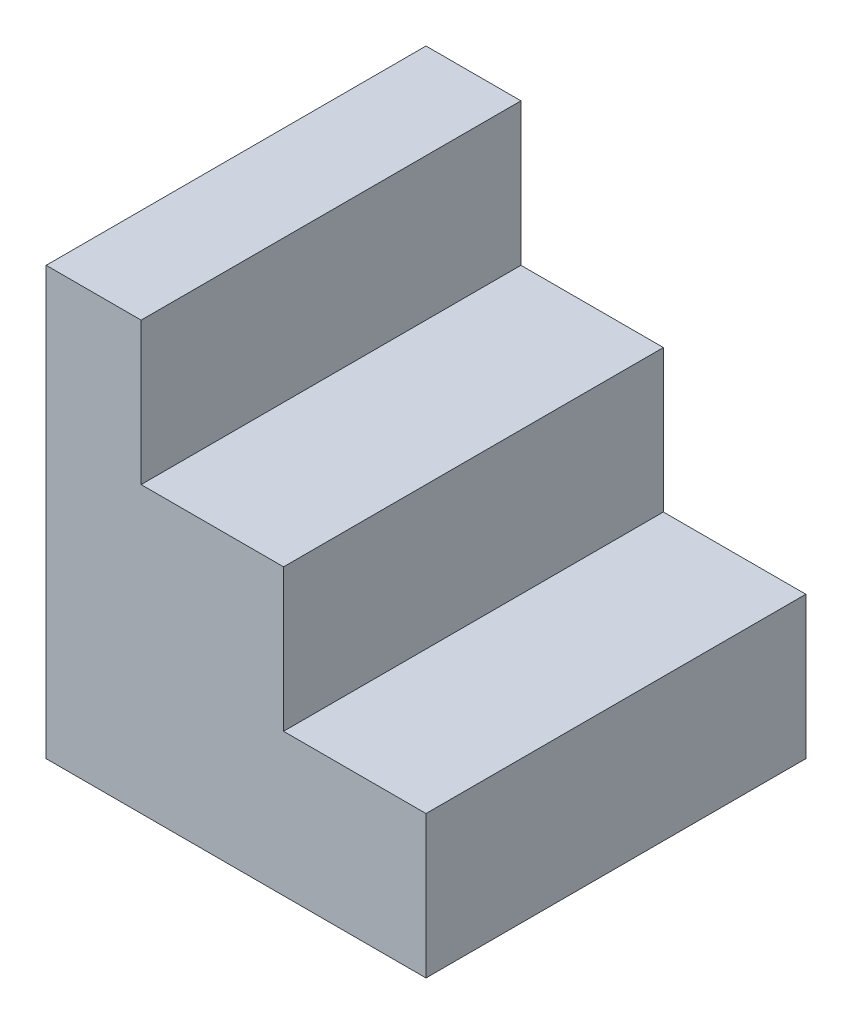
ISO-10303-21;
HEADER;
FILE_DESCRIPTION(('STEP AP214'),'2;1');
FILE_NAME('part.step','',(''),(''),'','','');
FILE_SCHEMA(('AUTOMOTIVE_DESIGN { 1 0 10303 214 1 1 1 1 }'));
ENDSEC;
DATA;
#1=APPLICATION_CONTEXT('core data for automotive mechanical design processes');
#2=APPLICATION_PROTOCOL_DEFINITION('international standard','automotive_design',2000,#1);
#3=PRODUCT_CONTEXT('',#1,'mechanical');
#4=PRODUCT('Part','Part','',(#3));
#5=PRODUCT_RELATED_PRODUCT_CATEGORY('part','',(#4));
#6=PRODUCT_DEFINITION_FORMATION('','',#4);
#7=PRODUCT_DEFINITION_CONTEXT('part definition',#1,'design');
#8=PRODUCT_DEFINITION('design','',#6,#7);
#9=PRODUCT_DEFINITION_SHAPE('','',#8);
#10=(LENGTH_UNIT() NAMED_UNIT(*) SI_UNIT(.MILLI.,.METRE.));
#11=(NAMED_UNIT(*) PLANE_ANGLE_UNIT() SI_UNIT($,.RADIAN.));
#12=(NAMED_UNIT(*) SI_UNIT($,.STERADIAN.) SOLID_ANGLE_UNIT());
#13=UNCERTAINTY_MEASURE_WITH_UNIT(LENGTH_MEASURE(1.E-05),#10,'distance_accuracy_value','');
#14=(GEOMETRIC_REPRESENTATION_CONTEXT(3) GLOBAL_UNCERTAINTY_ASSIGNED_CONTEXT((#13)) GLOBAL_UNIT_ASSIGNED_CONTEXT((#10,
#11,#12)) REPRESENTATION_CONTEXT('',''));
#15=CARTESIAN_POINT('',(0.,0.,0.));
#16=DIRECTION('',(0.,0.,1.));
#17=DIRECTION('',(1.,0.,0.));
#18=AXIS2_PLACEMENT_3D('',#15,#16,#17);
#19=CARTESIAN_POINT('',(20.,15.,-20.));
#20=DIRECTION('',(-1.,0.,0.));
#21=DIRECTION('',(0.,0.,1.));
#22=AXIS2_PLACEMENT_3D('',#19,#20,#21);
#23=PLANE('',#22);
#24=DIRECTION('',(0.,0.,-1.));
#25=VECTOR('',#24,1.);
#26=CARTESIAN_POINT('',(20.,0.,-20.));
#27=LINE('',#26,#25);
#28=CARTESIAN_POINT('',(20.,0.,20.));
#29=VERTEX_POINT('',#28);
#30=CARTESIAN_POINT('',(20.,0.,-20.));
#31=VERTEX_POINT('',#30);
#32=EDGE_CURVE('E144',#29,#31,#27,.T.);
#33=ORIENTED_EDGE('',*,*,#32,.T.);
#34=DIRECTION('',(0.,-1.,0.));
#35=VECTOR('',#34,1.);
#36=CARTESIAN_POINT('',(20.,15.,-20.));
#37=LINE('',#36,#35);
#38=CARTESIAN_POINT('',(20.,15.,-20.));
#39=VERTEX_POINT('',#38);
#40=EDGE_CURVE('E11',#39,#31,#37,.T.);
#41=ORIENTED_EDGE('',*,*,#40,.F.);
#42=DIRECTION('',(0.,0.,-1.));
#43=VECTOR('',#42,1.);
#44=CARTESIAN_POINT('',(20.,15.,-20.));
#45=LINE('',#44,#43);
#46=CARTESIAN_POINT('',(20.,15.,20.));
#47=VERTEX_POINT('',#46);
#48=EDGE_CURVE('E145',#47,#39,#45,.T.);
#49=ORIENTED_EDGE('',*,*,#48,.F.);
#50=DIRECTION('',(0.,-1.,0.));
#51=VECTOR('',#50,1.);
#52=CARTESIAN_POINT('',(20.,15.,20.));
#53=LINE('',#52,#51);
#54=EDGE_CURVE('E107',#47,#29,#53,.T.);
#55=ORIENTED_EDGE('',*,*,#54,.T.);
#56=EDGE_LOOP('',(#33,#41,#49,#55));
#57=FACE_BOUND('',#56,.T.);
#58=ADVANCED_FACE('F33',(#57),#23,.F.);
#59=CARTESIAN_POINT('',(-20.,15.,-20.));
#60=DIRECTION('',(0.,0.,1.));
#61=DIRECTION('',(1.,0.,0.));
#62=AXIS2_PLACEMENT_3D('',#59,#60,#61);
#63=PLANE('',#62);
#64=DIRECTION('',(-1.,0.,0.));
#65=VECTOR('',#64,1.);
#66=CARTESIAN_POINT('',(-20.,0.,-20.));
#67=LINE('',#66,#65);
#68=CARTESIAN_POINT('',(-20.,0.,-20.));
#69=VERTEX_POINT('',#68);
#70=EDGE_CURVE('E155',#31,#69,#67,.T.);
#71=ORIENTED_EDGE('',*,*,#70,.T.);
#72=DIRECTION('',(0.,-1.,0.));
#73=VECTOR('',#72,1.);
#74=CARTESIAN_POINT('',(-20.,15.,-20.));
#75=LINE('',#74,#73);
#76=CARTESIAN_POINT('',(-20.,45.,-20.));
#77=VERTEX_POINT('',#76);
#78=EDGE_CURVE('E40',#77,#69,#75,.T.);
#79=ORIENTED_EDGE('',*,*,#78,.F.);
#80=DIRECTION('',(-1.,0.,0.));
#81=VECTOR('',#80,1.);
#82=CARTESIAN_POINT('',(-20.,45.,-20.));
#83=LINE('',#82,#81);
#84=CARTESIAN_POINT('',(-9.99999999999999,45.,-20.));
#85=VERTEX_POINT('',#84);
#86=EDGE_CURVE('E121',#85,#77,#83,.T.);
#87=ORIENTED_EDGE('',*,*,#86,.F.);
#88=DIRECTION('',(0.,-1.,0.));
#89=VECTOR('',#88,1.);
#90=CARTESIAN_POINT('',(-9.99999999999999,45.,-20.));
#91=LINE('',#90,#89);
#92=CARTESIAN_POINT('',(-9.99999999999999,30.,-20.));
#93=VERTEX_POINT('',#92);
#94=EDGE_CURVE('E126',#85,#93,#91,.T.);
#95=ORIENTED_EDGE('',*,*,#94,.T.);
#96=DIRECTION('',(-1.,0.,0.));
#97=VECTOR('',#96,1.);
#98=CARTESIAN_POINT('',(-20.,30.,-20.));
#99=LINE('',#98,#97);
#100=CARTESIAN_POINT('',(5.,30.,-20.));
#101=VERTEX_POINT('',#100);
#102=EDGE_CURVE('E135',#101,#93,#99,.T.);
#103=ORIENTED_EDGE('',*,*,#102,.F.);
#104=DIRECTION('',(0.,-1.,0.));
#105=VECTOR('',#104,1.);
#106=CARTESIAN_POINT('',(5.,30.,-20.));
#107=LINE('',#106,#105);
#108=CARTESIAN_POINT('',(5.,15.,-20.));
#109=VERTEX_POINT('',#108);
#110=EDGE_CURVE('E137',#101,#109,#107,.T.);
#111=ORIENTED_EDGE('',*,*,#110,.T.);
#112=DIRECTION('',(-1.,0.,0.));
#113=VECTOR('',#112,1.);
#114=CARTESIAN_POINT('',(-20.,15.,-20.));
#115=LINE('',#114,#113);
#116=EDGE_CURVE('E148',#39,#109,#115,.T.);
#117=ORIENTED_EDGE('',*,*,#116,.F.);
#118=ORIENTED_EDGE('',*,*,#40,.T.);
#119=EDGE_LOOP('',(#71,#79,#87,#95,#103,#111,#117,#118));
#120=FACE_BOUND('',#119,.T.);
#121=ADVANCED_FACE('F179',(#120),#63,.F.);
#122=CARTESIAN_POINT('',(-20.,15.,-20.));
#123=DIRECTION('',(1.,0.,0.));
#124=DIRECTION('',(0.,0.,-1.));
#125=AXIS2_PLACEMENT_3D('',#122,#123,#124);
#126=PLANE('',#125);
#127=DIRECTION('',(0.,0.,1.));
#128=VECTOR('',#127,1.);
#129=CARTESIAN_POINT('',(-20.,0.,-20.));
#130=LINE('',#129,#128);
#131=CARTESIAN_POINT('',(-20.,0.,20.));
#132=VERTEX_POINT('',#131);
#133=EDGE_CURVE('E104',#69,#132,#130,.T.);
#134=ORIENTED_EDGE('',*,*,#133,.T.);
#135=DIRECTION('',(0.,-1.,0.));
#136=VECTOR('',#135,1.);
#137=CARTESIAN_POINT('',(-20.,15.,20.));
#138=LINE('',#137,#136);
#139=CARTESIAN_POINT('',(-20.,45.,20.));
#140=VERTEX_POINT('',#139);
#141=EDGE_CURVE('E97',#140,#132,#138,.T.);
#142=ORIENTED_EDGE('',*,*,#141,.F.);
#143=DIRECTION('',(0.,0.,1.));
#144=VECTOR('',#143,1.);
#145=CARTESIAN_POINT('',(-20.,45.,-20.));
#146=LINE('',#145,#144);
#147=EDGE_CURVE('E102',#77,#140,#146,.T.);
#148=ORIENTED_EDGE('',*,*,#147,.F.);
#149=ORIENTED_EDGE('',*,*,#78,.T.);
#150=EDGE_LOOP('',(#134,#142,#148,#149));
#151=FACE_BOUND('',#150,.T.);
#152=ADVANCED_FACE('F99',(#151),#126,.F.);
#153=CARTESIAN_POINT('',(-20.,15.,20.));
#154=DIRECTION('',(0.,0.,-1.));
#155=DIRECTION('',(-1.,0.,0.));
#156=AXIS2_PLACEMENT_3D('',#153,#154,#155);
#157=PLANE('',#156);
#158=DIRECTION('',(1.,0.,0.));
#159=VECTOR('',#158,1.);
#160=CARTESIAN_POINT('',(-20.,0.,20.));
#161=LINE('',#160,#159);
#162=EDGE_CURVE('E149',#132,#29,#161,.T.);
#163=ORIENTED_EDGE('',*,*,#162,.T.);
#164=ORIENTED_EDGE('',*,*,#54,.F.);
#165=DIRECTION('',(1.,0.,0.));
#166=VECTOR('',#165,1.);
#167=CARTESIAN_POINT('',(-20.,15.,20.));
#168=LINE('',#167,#166);
#169=CARTESIAN_POINT('',(5.,15.,20.));
#170=VERTEX_POINT('',#169);
#171=EDGE_CURVE('E151',#170,#47,#168,.T.);
#172=ORIENTED_EDGE('',*,*,#171,.F.);
#173=DIRECTION('',(0.,-1.,0.));
#174=VECTOR('',#173,1.);
#175=CARTESIAN_POINT('',(5.00000000000001,30.,20.));
#176=LINE('',#175,#174);
#177=CARTESIAN_POINT('',(5.00000000000001,30.,20.));
#178=VERTEX_POINT('',#177);
#179=EDGE_CURVE('E141',#178,#170,#176,.T.);
#180=ORIENTED_EDGE('',*,*,#179,.F.);
#181=DIRECTION('',(1.,0.,0.));
#182=VECTOR('',#181,1.);
#183=CARTESIAN_POINT('',(-20.,30.,20.));
#184=LINE('',#183,#182);
#185=CARTESIAN_POINT('',(-9.99999999999999,30.,20.));
#186=VERTEX_POINT('',#185);
#187=EDGE_CURVE('E131',#186,#178,#184,.T.);
#188=ORIENTED_EDGE('',*,*,#187,.F.);
#189=DIRECTION('',(0.,-1.,0.));
#190=VECTOR('',#189,1.);
#191=CARTESIAN_POINT('',(-9.99999999999999,45.,20.));
#192=LINE('',#191,#190);
#193=CARTESIAN_POINT('',(-9.99999999999999,45.,20.));
#194=VERTEX_POINT('',#193);
#195=EDGE_CURVE('E113',#194,#186,#192,.T.);
#196=ORIENTED_EDGE('',*,*,#195,.F.);
#197=DIRECTION('',(1.,0.,0.));
#198=VECTOR('',#197,1.);
#199=CARTESIAN_POINT('',(-20.,45.,20.));
#200=LINE('',#199,#198);
#201=EDGE_CURVE('E110',#140,#194,#200,.T.);
#202=ORIENTED_EDGE('',*,*,#201,.F.);
#203=ORIENTED_EDGE('',*,*,#141,.T.);
#204=EDGE_LOOP('',(#163,#164,#172,#180,#188,#196,#202,#203));
#205=FACE_BOUND('',#204,.T.);
#206=ADVANCED_FACE('F111',(#205),#157,.F.);
#207=CARTESIAN_POINT('',(0.,15.,0.));
#208=DIRECTION('',(0.,1.,0.));
#209=DIRECTION('',(0.,0.,1.));
#210=AXIS2_PLACEMENT_3D('',#207,#208,#209);
#211=PLANE('',#210);
#212=DIRECTION('',(0.,0.,-1.));
#213=VECTOR('',#212,1.);
#214=CARTESIAN_POINT('',(5.,15.,-20.));
#215=LINE('',#214,#213);
#216=EDGE_CURVE('E55',#170,#109,#215,.T.);
#217=ORIENTED_EDGE('',*,*,#216,.F.);
#218=ORIENTED_EDGE('',*,*,#171,.T.);
#219=ORIENTED_EDGE('',*,*,#48,.T.);
#220=ORIENTED_EDGE('',*,*,#116,.T.);
#221=EDGE_LOOP('',(#217,#218,#219,#220));
#222=FACE_BOUND('',#221,.T.);
#223=ADVANCED_FACE('F168',(#222),#211,.T.);
#224=CARTESIAN_POINT('',(0.,0.,0.));
#225=DIRECTION('',(0.,1.,0.));
#226=DIRECTION('',(0.,0.,1.));
#227=AXIS2_PLACEMENT_3D('',#224,#225,#226);
#228=PLANE('',#227);
#229=ORIENTED_EDGE('',*,*,#32,.F.);
#230=ORIENTED_EDGE('',*,*,#162,.F.);
#231=ORIENTED_EDGE('',*,*,#133,.F.);
#232=ORIENTED_EDGE('',*,*,#70,.F.);
#233=EDGE_LOOP('',(#229,#230,#231,#232));
#234=FACE_BOUND('',#233,.T.);
#235=ADVANCED_FACE('F163',(#234),#228,.F.);
#236=CARTESIAN_POINT('',(5.,30.,-20.));
#237=DIRECTION('',(-1.,0.,0.));
#238=DIRECTION('',(0.,0.,1.));
#239=AXIS2_PLACEMENT_3D('',#236,#237,#238);
#240=PLANE('',#239);
#241=ORIENTED_EDGE('',*,*,#216,.T.);
#242=ORIENTED_EDGE('',*,*,#110,.F.);
#243=DIRECTION('',(0.,0.,-1.));
#244=VECTOR('',#243,1.);
#245=CARTESIAN_POINT('',(5.,30.,-20.));
#246=LINE('',#245,#244);
#247=EDGE_CURVE('E133',#178,#101,#246,.T.);
#248=ORIENTED_EDGE('',*,*,#247,.F.);
#249=ORIENTED_EDGE('',*,*,#179,.T.);
#250=EDGE_LOOP('',(#241,#242,#248,#249));
#251=FACE_BOUND('',#250,.T.);
#252=ADVANCED_FACE('F172',(#251),#240,.F.);
#253=CARTESIAN_POINT('',(0.,30.,0.));
#254=DIRECTION('',(0.,1.,0.));
#255=DIRECTION('',(0.,0.,1.));
#256=AXIS2_PLACEMENT_3D('',#253,#254,#255);
#257=PLANE('',#256);
#258=DIRECTION('',(0.,0.,-1.));
#259=VECTOR('',#258,1.);
#260=CARTESIAN_POINT('',(-9.99999999999999,30.,-20.));
#261=LINE('',#260,#259);
#262=EDGE_CURVE('E47',#186,#93,#261,.T.);
#263=ORIENTED_EDGE('',*,*,#262,.F.);
#264=ORIENTED_EDGE('',*,*,#187,.T.);
#265=ORIENTED_EDGE('',*,*,#247,.T.);
#266=ORIENTED_EDGE('',*,*,#102,.T.);
#267=EDGE_LOOP('',(#263,#264,#265,#266));
#268=FACE_BOUND('',#267,.T.);
#269=ADVANCED_FACE('F175',(#268),#257,.T.);
#270=CARTESIAN_POINT('',(-9.99999999999999,45.,-20.));
#271=DIRECTION('',(-1.,0.,0.));
#272=DIRECTION('',(0.,0.,1.));
#273=AXIS2_PLACEMENT_3D('',#270,#271,#272);
#274=PLANE('',#273);
#275=ORIENTED_EDGE('',*,*,#262,.T.);
#276=ORIENTED_EDGE('',*,*,#94,.F.);
#277=DIRECTION('',(0.,0.,-1.));
#278=VECTOR('',#277,1.);
#279=CARTESIAN_POINT('',(-9.99999999999999,45.,-20.));
#280=LINE('',#279,#278);
#281=EDGE_CURVE('E116',#194,#85,#280,.T.);
#282=ORIENTED_EDGE('',*,*,#281,.F.);
#283=ORIENTED_EDGE('',*,*,#195,.T.);
#284=EDGE_LOOP('',(#275,#276,#282,#283));
#285=FACE_BOUND('',#284,.T.);
#286=ADVANCED_FACE('F177',(#285),#274,.F.);
#287=CARTESIAN_POINT('',(0.,45.,0.));
#288=DIRECTION('',(0.,1.,0.));
#289=DIRECTION('',(0.,0.,1.));
#290=AXIS2_PLACEMENT_3D('',#287,#288,#289);
#291=PLANE('',#290);
#292=ORIENTED_EDGE('',*,*,#147,.T.);
#293=ORIENTED_EDGE('',*,*,#201,.T.);
#294=ORIENTED_EDGE('',*,*,#281,.T.);
#295=ORIENTED_EDGE('',*,*,#86,.T.);
#296=EDGE_LOOP('',(#292,#293,#294,#295));
#297=FACE_BOUND('',#296,.T.);
#298=ADVANCED_FACE('F119',(#297),#291,.T.);
#299=CLOSED_SHELL('',(#58,#121,#152,#206,#223,#235,#252,#269,#286,#298));
#300=MANIFOLD_SOLID_BREP('B2',#299);
#301=ADVANCED_BREP_SHAPE_REPRESENTATION('',(#18,#300),#14);
#302=SHAPE_DEFINITION_REPRESENTATION(#9,#301);
ENDSEC;
END-ISO-10303-21;
